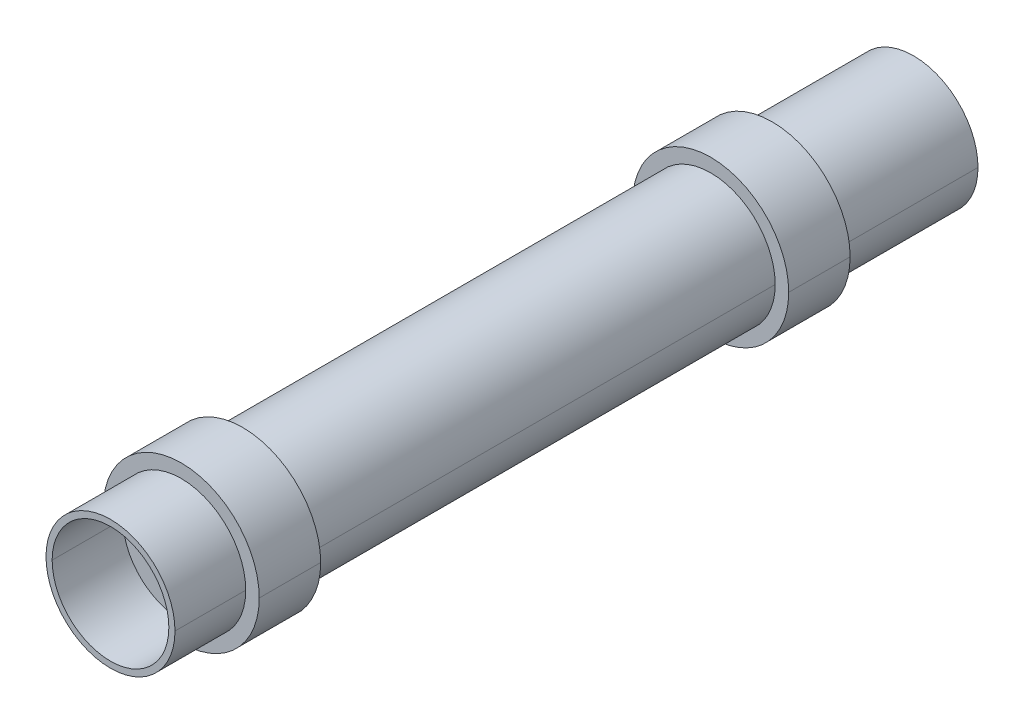
ISO-10303-21;
HEADER;
FILE_DESCRIPTION(('STEP AP214'),'2;1');
FILE_NAME('part.step','',(''),(''),'','','');
FILE_SCHEMA(('AUTOMOTIVE_DESIGN { 1 0 10303 214 1 1 1 1 }'));
ENDSEC;
DATA;
#1=APPLICATION_CONTEXT('core data for automotive mechanical design processes');
#2=APPLICATION_PROTOCOL_DEFINITION('international standard','automotive_design',2000,#1);
#3=PRODUCT_CONTEXT('',#1,'mechanical');
#4=PRODUCT('Part','Part','',(#3));
#5=PRODUCT_RELATED_PRODUCT_CATEGORY('part','',(#4));
#6=PRODUCT_DEFINITION_FORMATION('','',#4);
#7=PRODUCT_DEFINITION_CONTEXT('part definition',#1,'design');
#8=PRODUCT_DEFINITION('design','',#6,#7);
#9=PRODUCT_DEFINITION_SHAPE('','',#8);
#10=(LENGTH_UNIT() NAMED_UNIT(*) SI_UNIT(.MILLI.,.METRE.));
#11=(NAMED_UNIT(*) PLANE_ANGLE_UNIT() SI_UNIT($,.RADIAN.));
#12=(NAMED_UNIT(*) SI_UNIT($,.STERADIAN.) SOLID_ANGLE_UNIT());
#13=UNCERTAINTY_MEASURE_WITH_UNIT(LENGTH_MEASURE(1.E-05),#10,'distance_accuracy_value','');
#14=(GEOMETRIC_REPRESENTATION_CONTEXT(3) GLOBAL_UNCERTAINTY_ASSIGNED_CONTEXT((#13)) GLOBAL_UNIT_ASSIGNED_CONTEXT((#10,
#11,#12)) REPRESENTATION_CONTEXT('',''));
#15=CARTESIAN_POINT('',(0.,0.,0.));
#16=DIRECTION('',(0.,0.,1.));
#17=DIRECTION('',(1.,0.,0.));
#18=AXIS2_PLACEMENT_3D('',#15,#16,#17);
#19=CARTESIAN_POINT('',(0.,0.,146.05));
#20=DIRECTION('',(0.,0.,-1.));
#21=DIRECTION('',(-1.,0.,0.));
#22=AXIS2_PLACEMENT_3D('',#19,#20,#21);
#23=CYLINDRICAL_SURFACE('',#22,10.5);
#24=DIRECTION('',(0.,0.,-1.));
#25=VECTOR('',#24,1.);
#26=CARTESIAN_POINT('',(-10.5,0.,146.05));
#27=LINE('',#26,#25);
#28=CARTESIAN_POINT('',(-10.5,0.,130.74));
#29=VERTEX_POINT('',#28);
#30=CARTESIAN_POINT('',(-10.5,0.,119.22));
#31=VERTEX_POINT('',#30);
#32=EDGE_CURVE('E203',#29,#31,#27,.T.);
#33=ORIENTED_EDGE('',*,*,#32,.F.);
#34=CARTESIAN_POINT('',(0.,0.,130.74));
#35=DIRECTION('',(0.,0.,1.));
#36=DIRECTION('',(1.,0.,0.));
#37=AXIS2_PLACEMENT_3D('',#34,#35,#36);
#38=CIRCLE('',#37,10.5);
#39=CARTESIAN_POINT('',(10.5,0.,130.74));
#40=VERTEX_POINT('',#39);
#41=EDGE_CURVE('E69',#40,#29,#38,.T.);
#42=ORIENTED_EDGE('',*,*,#41,.F.);
#43=DIRECTION('',(0.,0.,-1.));
#44=VECTOR('',#43,1.);
#45=CARTESIAN_POINT('',(10.5,0.,146.05));
#46=LINE('',#45,#44);
#47=CARTESIAN_POINT('',(10.5,0.,119.22));
#48=VERTEX_POINT('',#47);
#49=EDGE_CURVE('E201',#40,#48,#46,.T.);
#50=ORIENTED_EDGE('',*,*,#49,.T.);
#51=CARTESIAN_POINT('',(0.,0.,119.22));
#52=DIRECTION('',(0.,0.,-1.));
#53=DIRECTION('',(-1.,0.,0.));
#54=AXIS2_PLACEMENT_3D('',#51,#52,#53);
#55=CIRCLE('',#54,10.5);
#56=EDGE_CURVE('E230',#31,#48,#55,.T.);
#57=ORIENTED_EDGE('',*,*,#56,.F.);
#58=EDGE_LOOP('',(#33,#42,#50,#57));
#59=FACE_BOUND('',#58,.T.);
#60=ADVANCED_FACE('F54',(#59),#23,.T.);
#61=CARTESIAN_POINT('',(0.,0.,146.05));
#62=DIRECTION('',(0.,0.,-1.));
#63=DIRECTION('',(-1.,0.,0.));
#64=AXIS2_PLACEMENT_3D('',#61,#62,#63);
#65=CYLINDRICAL_SURFACE('',#64,10.5);
#66=ORIENTED_EDGE('',*,*,#49,.F.);
#67=EDGE_CURVE('E192',#29,#40,#38,.T.);
#68=ORIENTED_EDGE('',*,*,#67,.F.);
#69=ORIENTED_EDGE('',*,*,#32,.T.);
#70=CARTESIAN_POINT('',(0.,0.,119.22));
#71=DIRECTION('',(0.,0.,-1.));
#72=DIRECTION('',(-1.,0.,0.));
#73=AXIS2_PLACEMENT_3D('',#70,#71,#72);
#74=CIRCLE('',#73,10.5);
#75=EDGE_CURVE('E208',#48,#31,#74,.T.);
#76=ORIENTED_EDGE('',*,*,#75,.F.);
#77=EDGE_LOOP('',(#66,#68,#69,#76));
#78=FACE_BOUND('',#77,.T.);
#79=ADVANCED_FACE('F206',(#78),#65,.T.);
#80=CARTESIAN_POINT('',(0.,0.,146.05));
#81=DIRECTION('',(0.,0.,-1.));
#82=DIRECTION('',(-1.,0.,0.));
#83=AXIS2_PLACEMENT_3D('',#80,#81,#82);
#84=CYLINDRICAL_SURFACE('',#83,9.5);
#85=CARTESIAN_POINT('',(0.,0.,23.02));
#86=DIRECTION('',(0.,0.,1.));
#87=DIRECTION('',(-1.,0.,0.));
#88=AXIS2_PLACEMENT_3D('',#85,#86,#87);
#89=CIRCLE('',#88,9.5);
#90=CARTESIAN_POINT('',(-9.5,0.,23.02));
#91=VERTEX_POINT('',#90);
#92=CARTESIAN_POINT('',(9.5,0.,23.02));
#93=VERTEX_POINT('',#92);
#94=EDGE_CURVE('E63',#91,#93,#89,.T.);
#95=ORIENTED_EDGE('',*,*,#94,.T.);
#96=DIRECTION('',(0.,0.,-1.));
#97=VECTOR('',#96,1.);
#98=CARTESIAN_POINT('',(9.5,0.,146.05));
#99=LINE('',#98,#97);
#100=CARTESIAN_POINT('',(9.5,0.,0.));
#101=VERTEX_POINT('',#100);
#102=EDGE_CURVE('E281',#93,#101,#99,.T.);
#103=ORIENTED_EDGE('',*,*,#102,.T.);
#104=CARTESIAN_POINT('',(0.,0.,0.));
#105=DIRECTION('',(0.,0.,-1.));
#106=DIRECTION('',(-1.,0.,0.));
#107=AXIS2_PLACEMENT_3D('',#104,#105,#106);
#108=CIRCLE('',#107,9.5);
#109=CARTESIAN_POINT('',(-9.5,0.,0.));
#110=VERTEX_POINT('',#109);
#111=EDGE_CURVE('E285',#101,#110,#108,.T.);
#112=ORIENTED_EDGE('',*,*,#111,.T.);
#113=DIRECTION('',(0.,0.,-1.));
#114=VECTOR('',#113,1.);
#115=CARTESIAN_POINT('',(-9.5,0.,146.05));
#116=LINE('',#115,#114);
#117=EDGE_CURVE('E253',#91,#110,#116,.T.);
#118=ORIENTED_EDGE('',*,*,#117,.F.);
#119=EDGE_LOOP('',(#95,#103,#112,#118));
#120=FACE_BOUND('',#119,.T.);
#121=ADVANCED_FACE('F400',(#120),#84,.F.);
#122=CARTESIAN_POINT('',(0.,0.,146.05));
#123=DIRECTION('',(0.,0.,-1.));
#124=DIRECTION('',(-1.,0.,0.));
#125=AXIS2_PLACEMENT_3D('',#122,#123,#124);
#126=CYLINDRICAL_SURFACE('',#125,10.5);
#127=CARTESIAN_POINT('',(0.,0.,23.02));
#128=DIRECTION('',(0.,0.,-1.));
#129=DIRECTION('',(-1.,0.,0.));
#130=AXIS2_PLACEMENT_3D('',#127,#128,#129);
#131=CIRCLE('',#130,10.5);
#132=CARTESIAN_POINT('',(-10.5,0.,23.02));
#133=VERTEX_POINT('',#132);
#134=CARTESIAN_POINT('',(10.5,0.,23.02));
#135=VERTEX_POINT('',#134);
#136=EDGE_CURVE('E246',#133,#135,#131,.T.);
#137=ORIENTED_EDGE('',*,*,#136,.T.);
#138=DIRECTION('',(0.,0.,-1.));
#139=VECTOR('',#138,1.);
#140=CARTESIAN_POINT('',(10.5,0.,146.05));
#141=LINE('',#140,#139);
#142=CARTESIAN_POINT('',(10.5,0.,0.));
#143=VERTEX_POINT('',#142);
#144=EDGE_CURVE('E319',#135,#143,#141,.T.);
#145=ORIENTED_EDGE('',*,*,#144,.T.);
#146=CARTESIAN_POINT('',(0.,0.,0.));
#147=DIRECTION('',(0.,0.,1.));
#148=DIRECTION('',(1.,0.,0.));
#149=AXIS2_PLACEMENT_3D('',#146,#147,#148);
#150=CIRCLE('',#149,10.5);
#151=CARTESIAN_POINT('',(-10.5,0.,0.));
#152=VERTEX_POINT('',#151);
#153=EDGE_CURVE('E267',#143,#152,#150,.T.);
#154=ORIENTED_EDGE('',*,*,#153,.T.);
#155=DIRECTION('',(0.,0.,-1.));
#156=VECTOR('',#155,1.);
#157=CARTESIAN_POINT('',(-10.5,0.,146.05));
#158=LINE('',#157,#156);
#159=EDGE_CURVE('E338',#133,#152,#158,.T.);
#160=ORIENTED_EDGE('',*,*,#159,.F.);
#161=EDGE_LOOP('',(#137,#145,#154,#160));
#162=FACE_BOUND('',#161,.T.);
#163=ADVANCED_FACE('F414',(#162),#126,.T.);
#164=CARTESIAN_POINT('',(0.,0.,23.02));
#165=DIRECTION('',(0.,0.,1.));
#166=DIRECTION('',(1.,0.,0.));
#167=AXIS2_PLACEMENT_3D('',#164,#165,#166);
#168=CYLINDRICAL_SURFACE('',#167,12.7);
#169=CARTESIAN_POINT('',(0.,0.,23.02));
#170=DIRECTION('',(0.,0.,-1.));
#171=DIRECTION('',(-1.,0.,0.));
#172=AXIS2_PLACEMENT_3D('',#169,#170,#171);
#173=CIRCLE('',#172,12.7);
#174=CARTESIAN_POINT('',(-12.7,0.,23.02));
#175=VERTEX_POINT('',#174);
#176=CARTESIAN_POINT('',(12.7,0.,23.02));
#177=VERTEX_POINT('',#176);
#178=EDGE_CURVE('E251',#175,#177,#173,.T.);
#179=ORIENTED_EDGE('',*,*,#178,.F.);
#180=DIRECTION('',(0.,0.,1.));
#181=VECTOR('',#180,1.);
#182=CARTESIAN_POINT('',(-12.7,0.,23.02));
#183=LINE('',#182,#181);
#184=CARTESIAN_POINT('',(-12.7,0.,33.02));
#185=VERTEX_POINT('',#184);
#186=EDGE_CURVE('E263',#175,#185,#183,.T.);
#187=ORIENTED_EDGE('',*,*,#186,.T.);
#188=CARTESIAN_POINT('',(0.,0.,33.02));
#189=DIRECTION('',(0.,0.,-1.));
#190=DIRECTION('',(-1.,0.,0.));
#191=AXIS2_PLACEMENT_3D('',#188,#189,#190);
#192=CIRCLE('',#191,12.7);
#193=CARTESIAN_POINT('',(12.7,0.,33.02));
#194=VERTEX_POINT('',#193);
#195=EDGE_CURVE('E268',#185,#194,#192,.T.);
#196=ORIENTED_EDGE('',*,*,#195,.T.);
#197=DIRECTION('',(0.,0.,1.));
#198=VECTOR('',#197,1.);
#199=CARTESIAN_POINT('',(12.7,0.,23.02));
#200=LINE('',#199,#198);
#201=EDGE_CURVE('E277',#177,#194,#200,.T.);
#202=ORIENTED_EDGE('',*,*,#201,.F.);
#203=EDGE_LOOP('',(#179,#187,#196,#202));
#204=FACE_BOUND('',#203,.T.);
#205=ADVANCED_FACE('F417',(#204),#168,.T.);
#206=CARTESIAN_POINT('',(0.,0.,119.22));
#207=DIRECTION('',(0.,0.,-1.));
#208=DIRECTION('',(-1.,0.,0.));
#209=AXIS2_PLACEMENT_3D('',#206,#207,#208);
#210=CYLINDRICAL_SURFACE('',#209,12.7);
#211=CARTESIAN_POINT('',(0.,0.,119.22));
#212=DIRECTION('',(0.,0.,-1.));
#213=DIRECTION('',(-1.,0.,0.));
#214=AXIS2_PLACEMENT_3D('',#211,#212,#213);
#215=CIRCLE('',#214,12.7);
#216=CARTESIAN_POINT('',(-12.7,0.,119.22));
#217=VERTEX_POINT('',#216);
#218=CARTESIAN_POINT('',(12.7,0.,119.22));
#219=VERTEX_POINT('',#218);
#220=EDGE_CURVE('E334',#217,#219,#215,.T.);
#221=ORIENTED_EDGE('',*,*,#220,.T.);
#222=DIRECTION('',(0.,0.,-1.));
#223=VECTOR('',#222,1.);
#224=CARTESIAN_POINT('',(12.7,0.,119.22));
#225=LINE('',#224,#223);
#226=CARTESIAN_POINT('',(12.7,0.,109.22));
#227=VERTEX_POINT('',#226);
#228=EDGE_CURVE('E216',#219,#227,#225,.T.);
#229=ORIENTED_EDGE('',*,*,#228,.T.);
#230=CARTESIAN_POINT('',(0.,0.,109.22));
#231=DIRECTION('',(0.,0.,-1.));
#232=DIRECTION('',(-1.,0.,0.));
#233=AXIS2_PLACEMENT_3D('',#230,#231,#232);
#234=CIRCLE('',#233,12.7);
#235=CARTESIAN_POINT('',(-12.7,0.,109.22));
#236=VERTEX_POINT('',#235);
#237=EDGE_CURVE('E242',#236,#227,#234,.T.);
#238=ORIENTED_EDGE('',*,*,#237,.F.);
#239=DIRECTION('',(0.,0.,-1.));
#240=VECTOR('',#239,1.);
#241=CARTESIAN_POINT('',(-12.7,0.,119.22));
#242=LINE('',#241,#240);
#243=EDGE_CURVE('E258',#217,#236,#242,.T.);
#244=ORIENTED_EDGE('',*,*,#243,.F.);
#245=EDGE_LOOP('',(#221,#229,#238,#244));
#246=FACE_BOUND('',#245,.T.);
#247=ADVANCED_FACE('F442',(#246),#210,.T.);
#248=CARTESIAN_POINT('',(0.,0.,146.05));
#249=DIRECTION('',(0.,0.,-1.));
#250=DIRECTION('',(-1.,0.,0.));
#251=AXIS2_PLACEMENT_3D('',#248,#249,#250);
#252=CYLINDRICAL_SURFACE('',#251,10.5);
#253=CARTESIAN_POINT('',(0.,0.,109.22));
#254=DIRECTION('',(0.,0.,-1.));
#255=DIRECTION('',(-1.,0.,0.));
#256=AXIS2_PLACEMENT_3D('',#253,#254,#255);
#257=CIRCLE('',#256,10.5);
#258=CARTESIAN_POINT('',(-10.5,0.,109.22));
#259=VERTEX_POINT('',#258);
#260=CARTESIAN_POINT('',(10.5,0.,109.22));
#261=VERTEX_POINT('',#260);
#262=EDGE_CURVE('E211',#259,#261,#257,.T.);
#263=ORIENTED_EDGE('',*,*,#262,.T.);
#264=DIRECTION('',(0.,0.,-1.));
#265=VECTOR('',#264,1.);
#266=CARTESIAN_POINT('',(10.5,0.,146.05));
#267=LINE('',#266,#265);
#268=CARTESIAN_POINT('',(10.5,0.,33.02));
#269=VERTEX_POINT('',#268);
#270=EDGE_CURVE('E219',#261,#269,#267,.T.);
#271=ORIENTED_EDGE('',*,*,#270,.T.);
#272=CARTESIAN_POINT('',(0.,0.,33.02));
#273=DIRECTION('',(0.,0.,-1.));
#274=DIRECTION('',(-1.,0.,0.));
#275=AXIS2_PLACEMENT_3D('',#272,#273,#274);
#276=CIRCLE('',#275,10.5);
#277=CARTESIAN_POINT('',(-10.5,0.,33.02));
#278=VERTEX_POINT('',#277);
#279=EDGE_CURVE('E248',#278,#269,#276,.T.);
#280=ORIENTED_EDGE('',*,*,#279,.F.);
#281=DIRECTION('',(0.,0.,-1.));
#282=VECTOR('',#281,1.);
#283=CARTESIAN_POINT('',(-10.5,0.,146.05));
#284=LINE('',#283,#282);
#285=EDGE_CURVE('E224',#259,#278,#284,.T.);
#286=ORIENTED_EDGE('',*,*,#285,.F.);
#287=EDGE_LOOP('',(#263,#271,#280,#286));
#288=FACE_BOUND('',#287,.T.);
#289=ADVANCED_FACE('F56',(#288),#252,.T.);
#290=CARTESIAN_POINT('',(0.,0.,146.05));
#291=DIRECTION('',(0.,0.,-1.));
#292=DIRECTION('',(-1.,0.,0.));
#293=AXIS2_PLACEMENT_3D('',#290,#291,#292);
#294=CYLINDRICAL_SURFACE('',#293,10.5);
#295=ORIENTED_EDGE('',*,*,#270,.F.);
#296=CARTESIAN_POINT('',(0.,0.,109.22));
#297=DIRECTION('',(0.,0.,-1.));
#298=DIRECTION('',(-1.,0.,0.));
#299=AXIS2_PLACEMENT_3D('',#296,#297,#298);
#300=CIRCLE('',#299,10.5);
#301=EDGE_CURVE('E289',#261,#259,#300,.T.);
#302=ORIENTED_EDGE('',*,*,#301,.T.);
#303=ORIENTED_EDGE('',*,*,#285,.T.);
#304=CARTESIAN_POINT('',(0.,0.,33.02));
#305=DIRECTION('',(0.,0.,-1.));
#306=DIRECTION('',(-1.,0.,0.));
#307=AXIS2_PLACEMENT_3D('',#304,#305,#306);
#308=CIRCLE('',#307,10.5);
#309=EDGE_CURVE('E252',#269,#278,#308,.T.);
#310=ORIENTED_EDGE('',*,*,#309,.F.);
#311=EDGE_LOOP('',(#295,#302,#303,#310));
#312=FACE_BOUND('',#311,.T.);
#313=ADVANCED_FACE('F373',(#312),#294,.T.);
#314=CARTESIAN_POINT('',(0.,0.,119.22));
#315=DIRECTION('',(0.,0.,-1.));
#316=DIRECTION('',(0.,-1.,0.));
#317=AXIS2_PLACEMENT_3D('',#314,#315,#316);
#318=PLANE('',#317);
#319=ORIENTED_EDGE('',*,*,#220,.F.);
#320=CARTESIAN_POINT('',(0.,0.,119.22));
#321=DIRECTION('',(0.,0.,-1.));
#322=DIRECTION('',(-1.,0.,0.));
#323=AXIS2_PLACEMENT_3D('',#320,#321,#322);
#324=CIRCLE('',#323,12.7);
#325=EDGE_CURVE('E260',#219,#217,#324,.T.);
#326=ORIENTED_EDGE('',*,*,#325,.F.);
#327=EDGE_LOOP('',(#319,#326));
#328=FACE_BOUND('',#327,.T.);
#329=ORIENTED_EDGE('',*,*,#56,.T.);
#330=ORIENTED_EDGE('',*,*,#75,.T.);
#331=EDGE_LOOP('',(#329,#330));
#332=FACE_BOUND('',#331,.T.);
#333=ADVANCED_FACE('F381',(#328,#332),#318,.F.);
#334=CARTESIAN_POINT('',(0.,0.,109.22));
#335=DIRECTION('',(0.,0.,-1.));
#336=DIRECTION('',(0.,-1.,0.));
#337=AXIS2_PLACEMENT_3D('',#334,#335,#336);
#338=PLANE('',#337);
#339=ORIENTED_EDGE('',*,*,#237,.T.);
#340=CARTESIAN_POINT('',(0.,0.,109.22));
#341=DIRECTION('',(0.,0.,-1.));
#342=DIRECTION('',(-1.,0.,0.));
#343=AXIS2_PLACEMENT_3D('',#340,#341,#342);
#344=CIRCLE('',#343,12.7);
#345=EDGE_CURVE('E290',#227,#236,#344,.T.);
#346=ORIENTED_EDGE('',*,*,#345,.T.);
#347=EDGE_LOOP('',(#339,#346));
#348=FACE_BOUND('',#347,.T.);
#349=ORIENTED_EDGE('',*,*,#262,.F.);
#350=ORIENTED_EDGE('',*,*,#301,.F.);
#351=EDGE_LOOP('',(#349,#350));
#352=FACE_BOUND('',#351,.T.);
#353=ADVANCED_FACE('F378',(#348,#352),#338,.T.);
#354=CARTESIAN_POINT('',(0.,0.,119.22));
#355=DIRECTION('',(0.,0.,-1.));
#356=DIRECTION('',(-1.,0.,0.));
#357=AXIS2_PLACEMENT_3D('',#354,#355,#356);
#358=CYLINDRICAL_SURFACE('',#357,12.7);
#359=ORIENTED_EDGE('',*,*,#228,.F.);
#360=ORIENTED_EDGE('',*,*,#325,.T.);
#361=ORIENTED_EDGE('',*,*,#243,.T.);
#362=ORIENTED_EDGE('',*,*,#345,.F.);
#363=EDGE_LOOP('',(#359,#360,#361,#362));
#364=FACE_BOUND('',#363,.T.);
#365=ADVANCED_FACE('F380',(#364),#358,.T.);
#366=CARTESIAN_POINT('',(0.,0.,23.02));
#367=DIRECTION('',(0.,0.,-1.));
#368=DIRECTION('',(0.,-1.,0.));
#369=AXIS2_PLACEMENT_3D('',#366,#367,#368);
#370=PLANE('',#369);
#371=CARTESIAN_POINT('',(0.,0.,23.02));
#372=DIRECTION('',(0.,0.,-1.));
#373=DIRECTION('',(-1.,0.,0.));
#374=AXIS2_PLACEMENT_3D('',#371,#372,#373);
#375=CIRCLE('',#374,12.7);
#376=EDGE_CURVE('E261',#177,#175,#375,.T.);
#377=ORIENTED_EDGE('',*,*,#376,.T.);
#378=ORIENTED_EDGE('',*,*,#178,.T.);
#379=EDGE_LOOP('',(#377,#378));
#380=FACE_BOUND('',#379,.T.);
#381=ORIENTED_EDGE('',*,*,#136,.F.);
#382=CARTESIAN_POINT('',(0.,0.,23.02));
#383=DIRECTION('',(0.,0.,-1.));
#384=DIRECTION('',(-1.,0.,0.));
#385=AXIS2_PLACEMENT_3D('',#382,#383,#384);
#386=CIRCLE('',#385,10.5);
#387=EDGE_CURVE('E341',#135,#133,#386,.T.);
#388=ORIENTED_EDGE('',*,*,#387,.F.);
#389=EDGE_LOOP('',(#381,#388));
#390=FACE_BOUND('',#389,.T.);
#391=ADVANCED_FACE('F388',(#380,#390),#370,.T.);
#392=CARTESIAN_POINT('',(0.,0.,33.02));
#393=DIRECTION('',(0.,0.,-1.));
#394=DIRECTION('',(0.,-1.,0.));
#395=AXIS2_PLACEMENT_3D('',#392,#393,#394);
#396=PLANE('',#395);
#397=CARTESIAN_POINT('',(0.,0.,33.02));
#398=DIRECTION('',(0.,0.,-1.));
#399=DIRECTION('',(-1.,0.,0.));
#400=AXIS2_PLACEMENT_3D('',#397,#398,#399);
#401=CIRCLE('',#400,12.7);
#402=EDGE_CURVE('E279',#194,#185,#401,.T.);
#403=ORIENTED_EDGE('',*,*,#402,.F.);
#404=ORIENTED_EDGE('',*,*,#195,.F.);
#405=EDGE_LOOP('',(#403,#404));
#406=FACE_BOUND('',#405,.T.);
#407=ORIENTED_EDGE('',*,*,#279,.T.);
#408=ORIENTED_EDGE('',*,*,#309,.T.);
#409=EDGE_LOOP('',(#407,#408));
#410=FACE_BOUND('',#409,.T.);
#411=ADVANCED_FACE('F371',(#406,#410),#396,.F.);
#412=CARTESIAN_POINT('',(0.,0.,23.02));
#413=DIRECTION('',(0.,0.,1.));
#414=DIRECTION('',(1.,0.,0.));
#415=AXIS2_PLACEMENT_3D('',#412,#413,#414);
#416=CYLINDRICAL_SURFACE('',#415,12.7);
#417=ORIENTED_EDGE('',*,*,#186,.F.);
#418=ORIENTED_EDGE('',*,*,#376,.F.);
#419=ORIENTED_EDGE('',*,*,#201,.T.);
#420=ORIENTED_EDGE('',*,*,#402,.T.);
#421=EDGE_LOOP('',(#417,#418,#419,#420));
#422=FACE_BOUND('',#421,.T.);
#423=ADVANCED_FACE('F410',(#422),#416,.T.);
#424=CARTESIAN_POINT('',(0.,0.,146.05));
#425=DIRECTION('',(0.,0.,-1.));
#426=DIRECTION('',(-1.,0.,0.));
#427=AXIS2_PLACEMENT_3D('',#424,#425,#426);
#428=CYLINDRICAL_SURFACE('',#427,10.5);
#429=ORIENTED_EDGE('',*,*,#144,.F.);
#430=ORIENTED_EDGE('',*,*,#387,.T.);
#431=ORIENTED_EDGE('',*,*,#159,.T.);
#432=CARTESIAN_POINT('',(0.,0.,0.));
#433=DIRECTION('',(0.,0.,1.));
#434=DIRECTION('',(1.,0.,0.));
#435=AXIS2_PLACEMENT_3D('',#432,#433,#434);
#436=CIRCLE('',#435,10.5);
#437=EDGE_CURVE('E342',#152,#143,#436,.T.);
#438=ORIENTED_EDGE('',*,*,#437,.T.);
#439=EDGE_LOOP('',(#429,#430,#431,#438));
#440=FACE_BOUND('',#439,.T.);
#441=ADVANCED_FACE('F406',(#440),#428,.T.);
#442=CARTESIAN_POINT('',(0.,0.,0.));
#443=DIRECTION('',(0.,0.,1.));
#444=DIRECTION('',(1.,0.,0.));
#445=AXIS2_PLACEMENT_3D('',#442,#443,#444);
#446=PLANE('',#445);
#447=ORIENTED_EDGE('',*,*,#437,.F.);
#448=ORIENTED_EDGE('',*,*,#153,.F.);
#449=EDGE_LOOP('',(#447,#448));
#450=FACE_BOUND('',#449,.T.);
#451=CARTESIAN_POINT('',(0.,0.,0.));
#452=DIRECTION('',(0.,0.,-1.));
#453=DIRECTION('',(-1.,0.,0.));
#454=AXIS2_PLACEMENT_3D('',#451,#452,#453);
#455=CIRCLE('',#454,9.5);
#456=EDGE_CURVE('E257',#110,#101,#455,.T.);
#457=ORIENTED_EDGE('',*,*,#456,.F.);
#458=ORIENTED_EDGE('',*,*,#111,.F.);
#459=EDGE_LOOP('',(#457,#458));
#460=FACE_BOUND('',#459,.T.);
#461=ADVANCED_FACE('F409',(#450,#460),#446,.F.);
#462=CARTESIAN_POINT('',(0.,0.,146.05));
#463=DIRECTION('',(0.,0.,-1.));
#464=DIRECTION('',(-1.,0.,0.));
#465=AXIS2_PLACEMENT_3D('',#462,#463,#464);
#466=CYLINDRICAL_SURFACE('',#465,9.5);
#467=ORIENTED_EDGE('',*,*,#102,.F.);
#468=CARTESIAN_POINT('',(0.,0.,23.02));
#469=DIRECTION('',(0.,0.,1.));
#470=DIRECTION('',(-1.,0.,0.));
#471=AXIS2_PLACEMENT_3D('',#468,#469,#470);
#472=CIRCLE('',#471,9.5);
#473=EDGE_CURVE('E256',#93,#91,#472,.T.);
#474=ORIENTED_EDGE('',*,*,#473,.T.);
#475=ORIENTED_EDGE('',*,*,#117,.T.);
#476=ORIENTED_EDGE('',*,*,#456,.T.);
#477=EDGE_LOOP('',(#467,#474,#475,#476));
#478=FACE_BOUND('',#477,.T.);
#479=ADVANCED_FACE('F424',(#478),#466,.F.);
#480=CARTESIAN_POINT('',(0.,0.,23.02));
#481=DIRECTION('',(0.,0.,-1.));
#482=DIRECTION('',(0.,-1.,0.));
#483=AXIS2_PLACEMENT_3D('',#480,#481,#482);
#484=PLANE('',#483);
#485=ORIENTED_EDGE('',*,*,#94,.F.);
#486=ORIENTED_EDGE('',*,*,#473,.F.);
#487=EDGE_LOOP('',(#485,#486));
#488=FACE_BOUND('',#487,.T.);
#489=ADVANCED_FACE('F403',(#488),#484,.T.);
#490=CARTESIAN_POINT('',(0.,0.,130.74));
#491=DIRECTION('',(0.,0.,1.));
#492=DIRECTION('',(1.,0.,0.));
#493=AXIS2_PLACEMENT_3D('',#490,#491,#492);
#494=PLANE('',#493);
#495=ORIENTED_EDGE('',*,*,#41,.T.);
#496=ORIENTED_EDGE('',*,*,#67,.T.);
#497=EDGE_LOOP('',(#495,#496));
#498=FACE_BOUND('',#497,.T.);
#499=CARTESIAN_POINT('',(0.,0.,130.74));
#500=DIRECTION('',(0.,0.,1.));
#501=DIRECTION('',(1.,0.,0.));
#502=AXIS2_PLACEMENT_3D('',#499,#500,#501);
#503=CIRCLE('',#502,9.5);
#504=CARTESIAN_POINT('',(9.5,0.,130.74));
#505=VERTEX_POINT('',#504);
#506=CARTESIAN_POINT('',(-9.5,0.,130.74));
#507=VERTEX_POINT('',#506);
#508=EDGE_CURVE('E75',#505,#507,#503,.F.);
#509=ORIENTED_EDGE('',*,*,#508,.T.);
#510=CARTESIAN_POINT('',(0.,0.,130.74));
#511=DIRECTION('',(0.,0.,1.));
#512=DIRECTION('',(1.,0.,0.));
#513=AXIS2_PLACEMENT_3D('',#510,#511,#512);
#514=CIRCLE('',#513,9.5);
#515=EDGE_CURVE('E11',#507,#505,#514,.F.);
#516=ORIENTED_EDGE('',*,*,#515,.T.);
#517=EDGE_LOOP('',(#509,#516));
#518=FACE_BOUND('',#517,.T.);
#519=ADVANCED_FACE('F193',(#498,#518),#494,.T.);
#520=CARTESIAN_POINT('',(0.,0.,119.22));
#521=DIRECTION('',(0.,0.,-1.));
#522=DIRECTION('',(0.,-1.,0.));
#523=AXIS2_PLACEMENT_3D('',#520,#521,#522);
#524=PLANE('',#523);
#525=CARTESIAN_POINT('',(0.,0.,119.22));
#526=DIRECTION('',(0.,0.,1.));
#527=DIRECTION('',(-1.,0.,0.));
#528=AXIS2_PLACEMENT_3D('',#525,#526,#527);
#529=CIRCLE('',#528,9.5);
#530=CARTESIAN_POINT('',(-9.5,0.,119.22));
#531=VERTEX_POINT('',#530);
#532=CARTESIAN_POINT('',(9.5,0.,119.22));
#533=VERTEX_POINT('',#532);
#534=EDGE_CURVE('E229',#531,#533,#529,.T.);
#535=ORIENTED_EDGE('',*,*,#534,.T.);
#536=CARTESIAN_POINT('',(0.,0.,119.22));
#537=DIRECTION('',(0.,0.,1.));
#538=DIRECTION('',(-1.,0.,0.));
#539=AXIS2_PLACEMENT_3D('',#536,#537,#538);
#540=CIRCLE('',#539,9.5);
#541=EDGE_CURVE('E226',#533,#531,#540,.T.);
#542=ORIENTED_EDGE('',*,*,#541,.T.);
#543=EDGE_LOOP('',(#535,#542));
#544=FACE_BOUND('',#543,.T.);
#545=ADVANCED_FACE('F452',(#544),#524,.F.);
#546=CARTESIAN_POINT('',(0.,0.,146.05));
#547=DIRECTION('',(0.,0.,-1.));
#548=DIRECTION('',(-1.,0.,0.));
#549=AXIS2_PLACEMENT_3D('',#546,#547,#548);
#550=CYLINDRICAL_SURFACE('',#549,9.5);
#551=ORIENTED_EDGE('',*,*,#515,.F.);
#552=DIRECTION('',(0.,0.,-1.));
#553=VECTOR('',#552,1.);
#554=CARTESIAN_POINT('',(-9.5,0.,146.05));
#555=LINE('',#554,#553);
#556=EDGE_CURVE('E225',#507,#531,#555,.T.);
#557=ORIENTED_EDGE('',*,*,#556,.T.);
#558=ORIENTED_EDGE('',*,*,#541,.F.);
#559=DIRECTION('',(0.,0.,-1.));
#560=VECTOR('',#559,1.);
#561=CARTESIAN_POINT('',(9.5,0.,146.05));
#562=LINE('',#561,#560);
#563=EDGE_CURVE('E210',#505,#533,#562,.T.);
#564=ORIENTED_EDGE('',*,*,#563,.F.);
#565=EDGE_LOOP('',(#551,#557,#558,#564));
#566=FACE_BOUND('',#565,.T.);
#567=ADVANCED_FACE('F438',(#566),#550,.F.);
#568=CARTESIAN_POINT('',(0.,0.,146.05));
#569=DIRECTION('',(0.,0.,-1.));
#570=DIRECTION('',(-1.,0.,0.));
#571=AXIS2_PLACEMENT_3D('',#568,#569,#570);
#572=CYLINDRICAL_SURFACE('',#571,9.5);
#573=ORIENTED_EDGE('',*,*,#508,.F.);
#574=ORIENTED_EDGE('',*,*,#563,.T.);
#575=ORIENTED_EDGE('',*,*,#534,.F.);
#576=ORIENTED_EDGE('',*,*,#556,.F.);
#577=EDGE_LOOP('',(#573,#574,#575,#576));
#578=FACE_BOUND('',#577,.T.);
#579=ADVANCED_FACE('F435',(#578),#572,.F.);
#580=CLOSED_SHELL('',(#60,#79,#121,#163,#205,#247,#289,#313,#333,#353,#365,#391,#411,#423,#441,
#461,#479,#489,#519,#545,#567,#579));
#581=CARTESIAN_POINT('',(0.,0.,146.05));
#582=DIRECTION('',(0.,0.,-1.));
#583=DIRECTION('',(-1.,0.,0.));
#584=AXIS2_PLACEMENT_3D('',#581,#582,#583);
#585=CYLINDRICAL_SURFACE('',#584,9.5);
#586=CARTESIAN_POINT('',(0.,0.,33.02));
#587=DIRECTION('',(0.,0.,1.));
#588=DIRECTION('',(-1.,0.,0.));
#589=AXIS2_PLACEMENT_3D('',#586,#587,#588);
#590=CIRCLE('',#589,9.5);
#591=CARTESIAN_POINT('',(9.5,0.,33.02));
#592=VERTEX_POINT('',#591);
#593=CARTESIAN_POINT('',(-9.5,0.,33.02));
#594=VERTEX_POINT('',#593);
#595=EDGE_CURVE('E276',#592,#594,#590,.T.);
#596=ORIENTED_EDGE('',*,*,#595,.F.);
#597=DIRECTION('',(0.,0.,-1.));
#598=VECTOR('',#597,1.);
#599=CARTESIAN_POINT('',(9.5,0.,146.05));
#600=LINE('',#599,#598);
#601=CARTESIAN_POINT('',(9.5,0.,109.22));
#602=VERTEX_POINT('',#601);
#603=EDGE_CURVE('E299',#602,#592,#600,.T.);
#604=ORIENTED_EDGE('',*,*,#603,.F.);
#605=CARTESIAN_POINT('',(0.,0.,109.22));
#606=DIRECTION('',(0.,0.,1.));
#607=DIRECTION('',(-1.,0.,0.));
#608=AXIS2_PLACEMENT_3D('',#605,#606,#607);
#609=CIRCLE('',#608,9.5);
#610=CARTESIAN_POINT('',(-9.5,0.,109.22));
#611=VERTEX_POINT('',#610);
#612=EDGE_CURVE('E275',#602,#611,#609,.T.);
#613=ORIENTED_EDGE('',*,*,#612,.T.);
#614=DIRECTION('',(0.,0.,-1.));
#615=VECTOR('',#614,1.);
#616=CARTESIAN_POINT('',(-9.5,0.,146.05));
#617=LINE('',#616,#615);
#618=EDGE_CURVE('E306',#611,#594,#617,.T.);
#619=ORIENTED_EDGE('',*,*,#618,.T.);
#620=EDGE_LOOP('',(#596,#604,#613,#619));
#621=FACE_BOUND('',#620,.T.);
#622=ADVANCED_FACE('F426',(#621),#585,.F.);
#623=CARTESIAN_POINT('',(0.,0.,109.22));
#624=DIRECTION('',(0.,0.,-1.));
#625=DIRECTION('',(0.,-1.,0.));
#626=AXIS2_PLACEMENT_3D('',#623,#624,#625);
#627=PLANE('',#626);
#628=ORIENTED_EDGE('',*,*,#612,.F.);
#629=CARTESIAN_POINT('',(0.,0.,109.22));
#630=DIRECTION('',(0.,0.,1.));
#631=DIRECTION('',(-1.,0.,0.));
#632=AXIS2_PLACEMENT_3D('',#629,#630,#631);
#633=CIRCLE('',#632,9.5);
#634=EDGE_CURVE('E271',#611,#602,#633,.T.);
#635=ORIENTED_EDGE('',*,*,#634,.F.);
#636=EDGE_LOOP('',(#628,#635));
#637=FACE_BOUND('',#636,.T.);
#638=ADVANCED_FACE('F429',(#637),#627,.T.);
#639=CARTESIAN_POINT('',(0.,0.,33.02));
#640=DIRECTION('',(0.,0.,-1.));
#641=DIRECTION('',(0.,-1.,0.));
#642=AXIS2_PLACEMENT_3D('',#639,#640,#641);
#643=PLANE('',#642);
#644=ORIENTED_EDGE('',*,*,#595,.T.);
#645=CARTESIAN_POINT('',(0.,0.,33.02));
#646=DIRECTION('',(0.,0.,1.));
#647=DIRECTION('',(-1.,0.,0.));
#648=AXIS2_PLACEMENT_3D('',#645,#646,#647);
#649=CIRCLE('',#648,9.5);
#650=EDGE_CURVE('E305',#594,#592,#649,.T.);
#651=ORIENTED_EDGE('',*,*,#650,.T.);
#652=EDGE_LOOP('',(#644,#651));
#653=FACE_BOUND('',#652,.T.);
#654=ADVANCED_FACE('F444',(#653),#643,.F.);
#655=CARTESIAN_POINT('',(0.,0.,146.05));
#656=DIRECTION('',(0.,0.,-1.));
#657=DIRECTION('',(-1.,0.,0.));
#658=AXIS2_PLACEMENT_3D('',#655,#656,#657);
#659=CYLINDRICAL_SURFACE('',#658,9.5);
#660=ORIENTED_EDGE('',*,*,#618,.F.);
#661=ORIENTED_EDGE('',*,*,#634,.T.);
#662=ORIENTED_EDGE('',*,*,#603,.T.);
#663=ORIENTED_EDGE('',*,*,#650,.F.);
#664=EDGE_LOOP('',(#660,#661,#662,#663));
#665=FACE_BOUND('',#664,.T.);
#666=ADVANCED_FACE('F447',(#665),#659,.F.);
#667=CLOSED_SHELL('',(#622,#638,#654,#666));
#668=ORIENTED_CLOSED_SHELL('',*,#667,.T.);
#669=BREP_WITH_VOIDS('B2',#580,(#668));
#670=ADVANCED_BREP_SHAPE_REPRESENTATION('',(#18,#669),#14);
#671=SHAPE_DEFINITION_REPRESENTATION(#9,#670);
ENDSEC;
END-ISO-10303-21;
